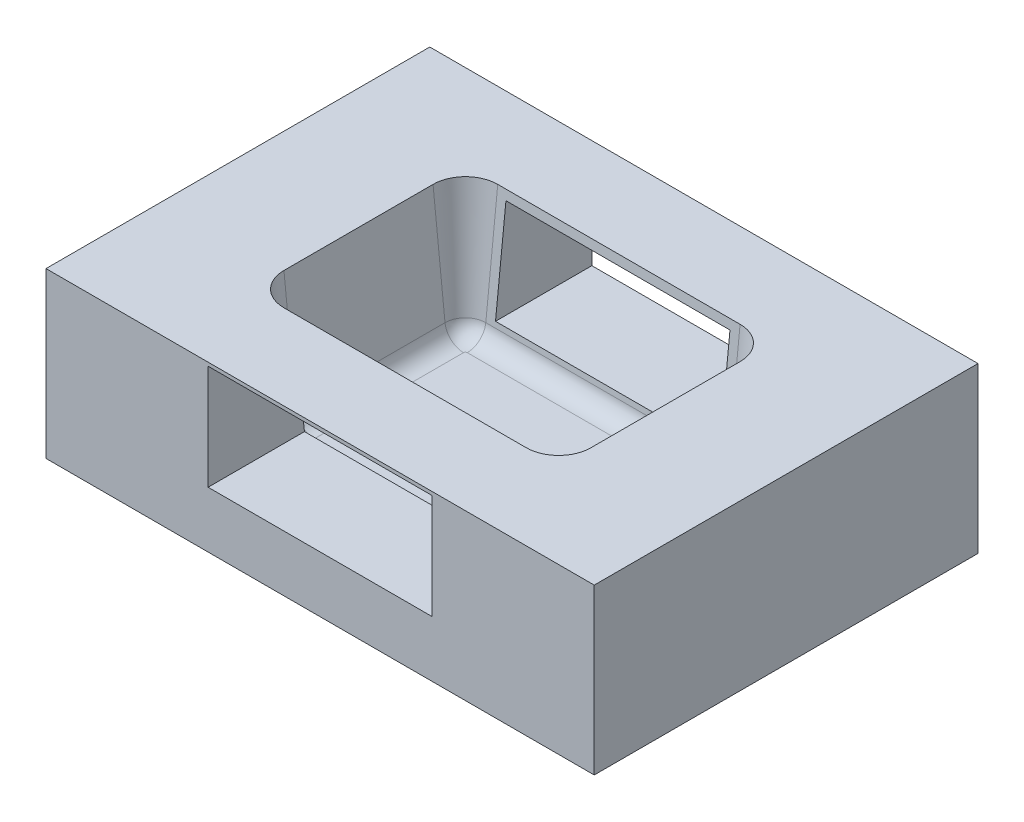
ISO-10303-21;
HEADER;
FILE_DESCRIPTION(('STEP AP214'),'2;1');
FILE_NAME('part.step','',(''),(''),'','','');
FILE_SCHEMA(('AUTOMOTIVE_DESIGN { 1 0 10303 214 1 1 1 1 }'));
ENDSEC;
DATA;
#1=APPLICATION_CONTEXT('core data for automotive mechanical design processes');
#2=APPLICATION_PROTOCOL_DEFINITION('international standard','automotive_design',2000,#1);
#3=PRODUCT_CONTEXT('',#1,'mechanical');
#4=PRODUCT('Part','Part','',(#3));
#5=PRODUCT_RELATED_PRODUCT_CATEGORY('part','',(#4));
#6=PRODUCT_DEFINITION_FORMATION('','',#4);
#7=PRODUCT_DEFINITION_CONTEXT('part definition',#1,'design');
#8=PRODUCT_DEFINITION('design','',#6,#7);
#9=PRODUCT_DEFINITION_SHAPE('','',#8);
#10=(LENGTH_UNIT() NAMED_UNIT(*) SI_UNIT(.MILLI.,.METRE.));
#11=(NAMED_UNIT(*) PLANE_ANGLE_UNIT() SI_UNIT($,.RADIAN.));
#12=(NAMED_UNIT(*) SI_UNIT($,.STERADIAN.) SOLID_ANGLE_UNIT());
#13=UNCERTAINTY_MEASURE_WITH_UNIT(LENGTH_MEASURE(1.E-05),#10,'distance_accuracy_value','');
#14=(GEOMETRIC_REPRESENTATION_CONTEXT(3) GLOBAL_UNCERTAINTY_ASSIGNED_CONTEXT((#13)) GLOBAL_UNIT_ASSIGNED_CONTEXT((#10,
#11,#12)) REPRESENTATION_CONTEXT('',''));
#15=CARTESIAN_POINT('',(0.,0.,0.));
#16=DIRECTION('',(0.,0.,1.));
#17=DIRECTION('',(1.,0.,0.));
#18=AXIS2_PLACEMENT_3D('',#15,#16,#17);
#19=CARTESIAN_POINT('',(61.3012654297794,65.8020102105601,-57.9818000816311));
#20=DIRECTION('',(0.,1.,0.));
#21=DIRECTION('',(0.,0.,1.));
#22=AXIS2_PLACEMENT_3D('',#19,#20,#21);
#23=PLANE('',#22);
#24=DIRECTION('',(1.,0.,0.));
#25=VECTOR('',#24,1.);
#26=CARTESIAN_POINT('',(-150.,65.8020102105601,-105.));
#27=LINE('',#26,#25);
#28=CARTESIAN_POINT('',(-61.2987345702204,65.8020102105601,-105.));
#29=VERTEX_POINT('',#28);
#30=CARTESIAN_POINT('',(61.3012654297794,65.8020102105601,-105.));
#31=VERTEX_POINT('',#30);
#32=EDGE_CURVE('E280',#29,#31,#27,.T.);
#33=ORIENTED_EDGE('',*,*,#32,.T.);
#34=DIRECTION('',(0.,0.,-1.));
#35=VECTOR('',#34,1.);
#36=CARTESIAN_POINT('',(61.3012654297794,65.8020102105601,-57.9818000816311));
#37=LINE('',#36,#35);
#38=CARTESIAN_POINT('',(61.3012654297794,65.8020102105601,-57.9818000816311));
#39=VERTEX_POINT('',#38);
#40=EDGE_CURVE('E50',#39,#31,#37,.T.);
#41=ORIENTED_EDGE('',*,*,#40,.F.);
#42=DIRECTION('',(1.,0.,0.));
#43=VECTOR('',#42,1.);
#44=CARTESIAN_POINT('',(-66.2987345702204,65.8020102105601,-57.9818000816311));
#45=LINE('',#44,#43);
#46=CARTESIAN_POINT('',(-61.2987345702204,65.8020102105601,-57.9818000816311));
#47=VERTEX_POINT('',#46);
#48=EDGE_CURVE('E58',#39,#47,#45,.F.);
#49=ORIENTED_EDGE('',*,*,#48,.T.);
#50=DIRECTION('',(0.,0.,-1.));
#51=VECTOR('',#50,1.);
#52=CARTESIAN_POINT('',(-61.2987345702204,65.8020102105601,-57.9818000816311));
#53=LINE('',#52,#51);
#54=EDGE_CURVE('E11',#47,#29,#53,.T.);
#55=ORIENTED_EDGE('',*,*,#54,.T.);
#56=EDGE_LOOP('',(#33,#41,#49,#55));
#57=FACE_BOUND('',#56,.T.);
#58=ADVANCED_FACE('F41',(#57),#23,.F.);
#59=CARTESIAN_POINT('',(-61.2987345702204,65.8020102105601,-57.9818000816311));
#60=DIRECTION('',(-1.,0.,0.));
#61=DIRECTION('',(0.,0.,1.));
#62=AXIS2_PLACEMENT_3D('',#59,#60,#61);
#63=PLANE('',#62);
#64=DIRECTION('',(0.,1.,0.));
#65=VECTOR('',#64,1.);
#66=CARTESIAN_POINT('',(-61.2987345702204,105.774619687402,-105.));
#67=LINE('',#66,#65);
#68=CARTESIAN_POINT('',(-61.2987345702204,11.4919950481763,-105.));
#69=VERTEX_POINT('',#68);
#70=EDGE_CURVE('E284',#69,#29,#67,.T.);
#71=ORIENTED_EDGE('',*,*,#70,.T.);
#72=ORIENTED_EDGE('',*,*,#54,.F.);
#73=DIRECTION('',(0.,0.994521895368273,-0.104528463267654));
#74=VECTOR('',#73,1.);
#75=CARTESIAN_POINT('',(-61.2987345702204,-0.625380312598491,-51.));
#76=LINE('',#75,#74);
#77=CARTESIAN_POINT('',(-61.2987345702204,11.4919950481763,-52.2735874707214));
#78=VERTEX_POINT('',#77);
#79=EDGE_CURVE('E273',#47,#78,#76,.F.);
#80=ORIENTED_EDGE('',*,*,#79,.T.);
#81=DIRECTION('',(0.,0.,-1.));
#82=VECTOR('',#81,1.);
#83=CARTESIAN_POINT('',(-61.2987345702204,11.4919950481763,-52.2735874707214));
#84=LINE('',#83,#82);
#85=EDGE_CURVE('E287',#78,#69,#84,.T.);
#86=ORIENTED_EDGE('',*,*,#85,.T.);
#87=EDGE_LOOP('',(#71,#72,#80,#86));
#88=FACE_BOUND('',#87,.T.);
#89=ADVANCED_FACE('F295',(#88),#63,.F.);
#90=CARTESIAN_POINT('',(61.3012654297794,11.4919950481763,-52.2735874707214));
#91=DIRECTION('',(0.,-1.,0.));
#92=DIRECTION('',(0.,0.,-1.));
#93=AXIS2_PLACEMENT_3D('',#90,#91,#92);
#94=PLANE('',#93);
#95=DIRECTION('',(-1.,0.,0.));
#96=VECTOR('',#95,1.);
#97=CARTESIAN_POINT('',(-150.,11.4919950481763,-105.));
#98=LINE('',#97,#96);
#99=CARTESIAN_POINT('',(61.3012654297794,11.4919950481763,-105.));
#100=VERTEX_POINT('',#99);
#101=EDGE_CURVE('E281',#100,#69,#98,.T.);
#102=ORIENTED_EDGE('',*,*,#101,.T.);
#103=ORIENTED_EDGE('',*,*,#85,.F.);
#104=DIRECTION('',(-1.,0.,0.));
#105=VECTOR('',#104,1.);
#106=CARTESIAN_POINT('',(-66.2987345702204,11.4919950481763,-52.2735874707214));
#107=LINE('',#106,#105);
#108=CARTESIAN_POINT('',(61.3012654297794,11.4919950481763,-52.2735874707214));
#109=VERTEX_POINT('',#108);
#110=EDGE_CURVE('E275',#78,#109,#107,.F.);
#111=ORIENTED_EDGE('',*,*,#110,.T.);
#112=DIRECTION('',(0.,0.,-1.));
#113=VECTOR('',#112,1.);
#114=CARTESIAN_POINT('',(61.3012654297794,11.4919950481763,-52.2735874707214));
#115=LINE('',#114,#113);
#116=EDGE_CURVE('E272',#109,#100,#115,.T.);
#117=ORIENTED_EDGE('',*,*,#116,.T.);
#118=EDGE_LOOP('',(#102,#103,#111,#117));
#119=FACE_BOUND('',#118,.T.);
#120=ADVANCED_FACE('F308',(#119),#94,.F.);
#121=CARTESIAN_POINT('',(61.3012654297794,65.8020102105601,-57.9818000816311));
#122=DIRECTION('',(1.,0.,0.));
#123=DIRECTION('',(0.,0.,-1.));
#124=AXIS2_PLACEMENT_3D('',#121,#122,#123);
#125=PLANE('',#124);
#126=DIRECTION('',(0.,-1.,0.));
#127=VECTOR('',#126,1.);
#128=CARTESIAN_POINT('',(61.3012654297794,105.774619687401,-105.));
#129=LINE('',#128,#127);
#130=EDGE_CURVE('E45',#31,#100,#129,.T.);
#131=ORIENTED_EDGE('',*,*,#130,.T.);
#132=ORIENTED_EDGE('',*,*,#116,.F.);
#133=DIRECTION('',(0.,-0.994521895368273,0.104528463267654));
#134=VECTOR('',#133,1.);
#135=CARTESIAN_POINT('',(61.3012654297794,-0.625380312598508,-51.));
#136=LINE('',#135,#134);
#137=EDGE_CURVE('E277',#109,#39,#136,.F.);
#138=ORIENTED_EDGE('',*,*,#137,.T.);
#139=ORIENTED_EDGE('',*,*,#40,.T.);
#140=EDGE_LOOP('',(#131,#132,#138,#139));
#141=FACE_BOUND('',#140,.T.);
#142=ADVANCED_FACE('F43',(#141),#125,.F.);
#143=CARTESIAN_POINT('',(-66.2987345702205,9.57461968740151,40.8));
#144=DIRECTION('',(0.,1.,0.));
#145=DIRECTION('',(0.,0.,1.));
#146=AXIS2_PLACEMENT_3D('',#143,#144,#145);
#147=DEGENERATE_TOROIDAL_SURFACE('',#146,1.01587874816203,10.2,.T.);
#148=CARTESIAN_POINT('',(-67.3146133183826,9.57461968740151,40.7999999999999));
#149=DIRECTION('',(0.,0.,1.));
#150=DIRECTION('',(0.,-1.,0.));
#151=AXIS2_PLACEMENT_3D('',#148,#149,#150);
#152=CIRCLE('',#151,10.2);
#153=CARTESIAN_POINT('',(-77.4587366511389,8.50842936207144,40.7999999999999));
#154=VERTEX_POINT('',#153);
#155=CARTESIAN_POINT('',(-67.3146133183826,-0.625380312598492,40.8));
#156=VERTEX_POINT('',#155);
#157=EDGE_CURVE('E370',#154,#156,#152,.T.);
#158=ORIENTED_EDGE('',*,*,#157,.F.);
#159=CARTESIAN_POINT('',(-66.2987345702205,8.50842936207143,40.8));
#160=DIRECTION('',(0.,-1.,0.));
#161=DIRECTION('',(0.,0.,-1.));
#162=AXIS2_PLACEMENT_3D('',#159,#160,#161);
#163=CIRCLE('',#162,11.1600020809184);
#164=CARTESIAN_POINT('',(-66.2987345702204,8.50842936207144,51.9600020809184));
#165=VERTEX_POINT('',#164);
#166=EDGE_CURVE('E366',#154,#165,#163,.F.);
#167=ORIENTED_EDGE('',*,*,#166,.T.);
#168=CARTESIAN_POINT('',(-66.2987345702205,9.57461968740151,41.815878748162));
#169=DIRECTION('',(-1.,0.,0.));
#170=DIRECTION('',(0.,0.,1.));
#171=AXIS2_PLACEMENT_3D('',#168,#169,#170);
#172=CIRCLE('',#171,10.2);
#173=CARTESIAN_POINT('',(-66.2987345702205,-0.625380312598492,41.815878748162));
#174=VERTEX_POINT('',#173);
#175=EDGE_CURVE('E407',#174,#165,#172,.T.);
#176=ORIENTED_EDGE('',*,*,#175,.F.);
#177=CARTESIAN_POINT('',(-66.2987345702205,-0.625380312598492,40.8));
#178=DIRECTION('',(0.,1.,0.));
#179=DIRECTION('',(0.,0.,1.));
#180=AXIS2_PLACEMENT_3D('',#177,#178,#179);
#181=CIRCLE('',#180,1.01587874816203);
#182=EDGE_CURVE('E362',#174,#156,#181,.F.);
#183=ORIENTED_EDGE('',*,*,#182,.T.);
#184=EDGE_LOOP('',(#158,#167,#176,#183));
#185=FACE_BOUND('',#184,.T.);
#186=ADVANCED_FACE('F319',(#185),#147,.F.);
#187=CARTESIAN_POINT('',(-66.2987345702204,9.57461968740151,41.815878748162));
#188=DIRECTION('',(-1.,0.,0.));
#189=DIRECTION('',(0.,0.,1.));
#190=AXIS2_PLACEMENT_3D('',#187,#188,#189);
#191=CYLINDRICAL_SURFACE('',#190,10.2);
#192=CARTESIAN_POINT('',(66.3012654297795,9.57461968740151,41.815878748162));
#193=DIRECTION('',(-1.,0.,0.));
#194=DIRECTION('',(0.,0.,1.));
#195=AXIS2_PLACEMENT_3D('',#192,#193,#194);
#196=CIRCLE('',#195,10.2);
#197=CARTESIAN_POINT('',(66.3012654297795,-0.625380312598492,41.815878748162));
#198=VERTEX_POINT('',#197);
#199=CARTESIAN_POINT('',(66.3012654297794,8.50842936207144,51.9600020809184));
#200=VERTEX_POINT('',#199);
#201=EDGE_CURVE('E400',#198,#200,#196,.T.);
#202=ORIENTED_EDGE('',*,*,#201,.F.);
#203=DIRECTION('',(-1.,0.,0.));
#204=VECTOR('',#203,1.);
#205=CARTESIAN_POINT('',(-66.2987345702205,-0.625380312598492,41.815878748162));
#206=LINE('',#205,#204);
#207=EDGE_CURVE('E235',#198,#174,#206,.T.);
#208=ORIENTED_EDGE('',*,*,#207,.T.);
#209=ORIENTED_EDGE('',*,*,#175,.T.);
#210=DIRECTION('',(1.,0.,0.));
#211=VECTOR('',#210,1.);
#212=CARTESIAN_POINT('',(-66.2987345702204,8.50842936207144,51.9600020809184));
#213=LINE('',#212,#211);
#214=EDGE_CURVE('E403',#165,#200,#213,.T.);
#215=ORIENTED_EDGE('',*,*,#214,.T.);
#216=EDGE_LOOP('',(#202,#208,#209,#215));
#217=FACE_BOUND('',#216,.T.);
#218=ADVANCED_FACE('F481',(#217),#191,.F.);
#219=CARTESIAN_POINT('',(-61.2987345702205,68.8502354840354,58.3021814679172));
#220=DIRECTION('',(0.,1.,0.));
#221=DIRECTION('',(0.,0.,1.));
#222=AXIS2_PLACEMENT_3D('',#219,#220,#221);
#223=PLANE('',#222);
#224=DIRECTION('',(-1.,0.,0.));
#225=VECTOR('',#224,1.);
#226=CARTESIAN_POINT('',(-150.,68.8502354840354,105.));
#227=LINE('',#226,#225);
#228=CARTESIAN_POINT('',(61.3012654297794,68.8502354840354,105.));
#229=VERTEX_POINT('',#228);
#230=CARTESIAN_POINT('',(-61.2987345702205,68.8502354840354,105.));
#231=VERTEX_POINT('',#230);
#232=EDGE_CURVE('E253',#229,#231,#227,.T.);
#233=ORIENTED_EDGE('',*,*,#232,.T.);
#234=DIRECTION('',(0.,0.,1.));
#235=VECTOR('',#234,1.);
#236=CARTESIAN_POINT('',(-61.2987345702205,68.8502354840354,58.3021814679172));
#237=LINE('',#236,#235);
#238=CARTESIAN_POINT('',(-61.2987345702205,68.8502354840354,58.3021814679172));
#239=VERTEX_POINT('',#238);
#240=EDGE_CURVE('E262',#239,#231,#237,.T.);
#241=ORIENTED_EDGE('',*,*,#240,.F.);
#242=DIRECTION('',(-1.,0.,0.));
#243=VECTOR('',#242,1.);
#244=CARTESIAN_POINT('',(-66.2987345702204,68.8502354840354,58.3021814679172));
#245=LINE('',#244,#243);
#246=CARTESIAN_POINT('',(61.3012654297794,68.8502354840354,58.3021814679172));
#247=VERTEX_POINT('',#246);
#248=EDGE_CURVE('E243',#239,#247,#245,.F.);
#249=ORIENTED_EDGE('',*,*,#248,.T.);
#250=DIRECTION('',(0.,0.,1.));
#251=VECTOR('',#250,1.);
#252=CARTESIAN_POINT('',(61.3012654297794,68.8502354840354,58.3021814679172));
#253=LINE('',#252,#251);
#254=EDGE_CURVE('E263',#247,#229,#253,.T.);
#255=ORIENTED_EDGE('',*,*,#254,.T.);
#256=EDGE_LOOP('',(#233,#241,#249,#255));
#257=FACE_BOUND('',#256,.T.);
#258=ADVANCED_FACE('F532',(#257),#223,.F.);
#259=CARTESIAN_POINT('',(61.3012654297794,68.8502354840354,58.3021814679172));
#260=DIRECTION('',(1.,0.,0.));
#261=DIRECTION('',(0.,1.,0.));
#262=AXIS2_PLACEMENT_3D('',#259,#260,#261);
#263=PLANE('',#262);
#264=DIRECTION('',(0.,1.,0.));
#265=VECTOR('',#264,1.);
#266=CARTESIAN_POINT('',(61.3012654297794,105.774619687402,105.));
#267=LINE('',#266,#265);
#268=CARTESIAN_POINT('',(61.3012654297794,11.4919950481763,105.));
#269=VERTEX_POINT('',#268);
#270=EDGE_CURVE('E256',#269,#229,#267,.T.);
#271=ORIENTED_EDGE('',*,*,#270,.T.);
#272=ORIENTED_EDGE('',*,*,#254,.F.);
#273=DIRECTION('',(0.,0.994521895368273,0.104528463267654));
#274=VECTOR('',#273,1.);
#275=CARTESIAN_POINT('',(61.3012654297794,-0.625380312598446,51.));
#276=LINE('',#275,#274);
#277=CARTESIAN_POINT('',(61.3012654297794,11.4919950481763,52.2735874707214));
#278=VERTEX_POINT('',#277);
#279=EDGE_CURVE('E246',#247,#278,#276,.F.);
#280=ORIENTED_EDGE('',*,*,#279,.T.);
#281=DIRECTION('',(0.,0.,1.));
#282=VECTOR('',#281,1.);
#283=CARTESIAN_POINT('',(61.3012654297794,11.4919950481763,52.2735874707214));
#284=LINE('',#283,#282);
#285=EDGE_CURVE('E259',#278,#269,#284,.T.);
#286=ORIENTED_EDGE('',*,*,#285,.T.);
#287=EDGE_LOOP('',(#271,#272,#280,#286));
#288=FACE_BOUND('',#287,.T.);
#289=ADVANCED_FACE('F535',(#288),#263,.F.);
#290=CARTESIAN_POINT('',(-61.2987345702204,11.4919950481763,52.2735874707214));
#291=DIRECTION('',(0.,-1.,0.));
#292=DIRECTION('',(0.,0.,-1.));
#293=AXIS2_PLACEMENT_3D('',#290,#291,#292);
#294=PLANE('',#293);
#295=DIRECTION('',(1.,0.,0.));
#296=VECTOR('',#295,1.);
#297=CARTESIAN_POINT('',(-150.,11.4919950481763,105.));
#298=LINE('',#297,#296);
#299=CARTESIAN_POINT('',(-61.2987345702204,11.4919950481763,105.));
#300=VERTEX_POINT('',#299);
#301=EDGE_CURVE('E231',#300,#269,#298,.T.);
#302=ORIENTED_EDGE('',*,*,#301,.T.);
#303=ORIENTED_EDGE('',*,*,#285,.F.);
#304=DIRECTION('',(1.,0.,0.));
#305=VECTOR('',#304,1.);
#306=CARTESIAN_POINT('',(-66.2987345702204,11.4919950481763,52.2735874707214));
#307=LINE('',#306,#305);
#308=CARTESIAN_POINT('',(-61.2987345702205,11.4919950481763,52.2735874707214));
#309=VERTEX_POINT('',#308);
#310=EDGE_CURVE('E248',#278,#309,#307,.F.);
#311=ORIENTED_EDGE('',*,*,#310,.T.);
#312=DIRECTION('',(0.,0.,1.));
#313=VECTOR('',#312,1.);
#314=CARTESIAN_POINT('',(-61.2987345702204,11.4919950481763,52.2735874707214));
#315=LINE('',#314,#313);
#316=EDGE_CURVE('E245',#309,#300,#315,.T.);
#317=ORIENTED_EDGE('',*,*,#316,.T.);
#318=EDGE_LOOP('',(#302,#303,#311,#317));
#319=FACE_BOUND('',#318,.T.);
#320=ADVANCED_FACE('F538',(#319),#294,.F.);
#321=CARTESIAN_POINT('',(-61.2987345702205,68.8502354840354,58.3021814679172));
#322=DIRECTION('',(-1.,0.,0.));
#323=DIRECTION('',(0.,0.,1.));
#324=AXIS2_PLACEMENT_3D('',#321,#322,#323);
#325=PLANE('',#324);
#326=DIRECTION('',(0.,-1.,0.));
#327=VECTOR('',#326,1.);
#328=CARTESIAN_POINT('',(-61.2987345702205,105.774619687402,105.));
#329=LINE('',#328,#327);
#330=EDGE_CURVE('E228',#231,#300,#329,.T.);
#331=ORIENTED_EDGE('',*,*,#330,.T.);
#332=ORIENTED_EDGE('',*,*,#316,.F.);
#333=DIRECTION('',(0.,-0.994521895368273,-0.104528463267654));
#334=VECTOR('',#333,1.);
#335=CARTESIAN_POINT('',(-61.2987345702204,-0.625380312598491,51.));
#336=LINE('',#335,#334);
#337=EDGE_CURVE('E250',#309,#239,#336,.F.);
#338=ORIENTED_EDGE('',*,*,#337,.T.);
#339=ORIENTED_EDGE('',*,*,#240,.T.);
#340=EDGE_LOOP('',(#331,#332,#338,#339));
#341=FACE_BOUND('',#340,.T.);
#342=ADVANCED_FACE('F311',(#341),#325,.F.);
#343=CARTESIAN_POINT('',(66.3012654297795,9.57461968740151,40.8));
#344=DIRECTION('',(0.,1.,0.));
#345=DIRECTION('',(0.,0.,1.));
#346=AXIS2_PLACEMENT_3D('',#343,#344,#345);
#347=DEGENERATE_TOROIDAL_SURFACE('',#346,1.01587874816203,10.2,.T.);
#348=CARTESIAN_POINT('',(67.3171441779415,9.57461968740151,40.7999999999999));
#349=DIRECTION('',(0.,0.,1.));
#350=DIRECTION('',(1.,0.,0.));
#351=AXIS2_PLACEMENT_3D('',#348,#349,#350);
#352=CIRCLE('',#351,10.2);
#353=CARTESIAN_POINT('',(67.3171441779415,-0.625380312598492,40.7999999999999));
#354=VERTEX_POINT('',#353);
#355=CARTESIAN_POINT('',(77.4612675106979,8.50842936207144,40.7999999999999));
#356=VERTEX_POINT('',#355);
#357=EDGE_CURVE('E393',#354,#356,#352,.T.);
#358=ORIENTED_EDGE('',*,*,#357,.F.);
#359=CARTESIAN_POINT('',(66.3012654297795,-0.625380312598492,40.8));
#360=DIRECTION('',(0.,1.,0.));
#361=DIRECTION('',(0.,0.,1.));
#362=AXIS2_PLACEMENT_3D('',#359,#360,#361);
#363=CIRCLE('',#362,1.01587874816203);
#364=EDGE_CURVE('E406',#354,#198,#363,.F.);
#365=ORIENTED_EDGE('',*,*,#364,.T.);
#366=ORIENTED_EDGE('',*,*,#201,.T.);
#367=CARTESIAN_POINT('',(66.3012654297795,8.50842936207143,40.8));
#368=DIRECTION('',(0.,-1.,0.));
#369=DIRECTION('',(0.,0.,-1.));
#370=AXIS2_PLACEMENT_3D('',#367,#368,#369);
#371=CIRCLE('',#370,11.1600020809184);
#372=EDGE_CURVE('E396',#200,#356,#371,.F.);
#373=ORIENTED_EDGE('',*,*,#372,.T.);
#374=EDGE_LOOP('',(#358,#365,#366,#373));
#375=FACE_BOUND('',#374,.T.);
#376=ADVANCED_FACE('F427',(#375),#347,.F.);
#377=CARTESIAN_POINT('',(-67.3146133183826,9.57461968740151,-40.7999999999999));
#378=DIRECTION('',(0.,0.,-1.));
#379=DIRECTION('',(-1.,0.,0.));
#380=AXIS2_PLACEMENT_3D('',#377,#378,#379);
#381=CYLINDRICAL_SURFACE('',#380,10.2);
#382=CARTESIAN_POINT('',(-67.3146133183826,9.57461968740151,-40.8));
#383=DIRECTION('',(0.,0.,1.));
#384=DIRECTION('',(0.,-1.,0.));
#385=AXIS2_PLACEMENT_3D('',#382,#383,#384);
#386=CIRCLE('',#385,10.2);
#387=CARTESIAN_POINT('',(-77.4587366511389,8.50842936207144,-40.7999999999999));
#388=VERTEX_POINT('',#387);
#389=CARTESIAN_POINT('',(-67.3146133183826,-0.625380312598492,-40.7999999999999));
#390=VERTEX_POINT('',#389);
#391=EDGE_CURVE('E375',#388,#390,#386,.T.);
#392=ORIENTED_EDGE('',*,*,#391,.F.);
#393=DIRECTION('',(0.,0.,1.));
#394=VECTOR('',#393,1.);
#395=CARTESIAN_POINT('',(-77.4587366511389,8.50842936207144,-40.7999999999999));
#396=LINE('',#395,#394);
#397=EDGE_CURVE('E372',#388,#154,#396,.T.);
#398=ORIENTED_EDGE('',*,*,#397,.T.);
#399=ORIENTED_EDGE('',*,*,#157,.T.);
#400=DIRECTION('',(0.,0.,-1.));
#401=VECTOR('',#400,1.);
#402=CARTESIAN_POINT('',(-67.3146133183826,-0.625380312598492,40.8));
#403=LINE('',#402,#401);
#404=EDGE_CURVE('E369',#156,#390,#403,.T.);
#405=ORIENTED_EDGE('',*,*,#404,.T.);
#406=EDGE_LOOP('',(#392,#398,#399,#405));
#407=FACE_BOUND('',#406,.T.);
#408=ADVANCED_FACE('F500',(#407),#381,.F.);
#409=CARTESIAN_POINT('',(67.3171441779415,9.57461968740151,-40.7999999999999));
#410=DIRECTION('',(0.,0.,1.));
#411=DIRECTION('',(1.,0.,0.));
#412=AXIS2_PLACEMENT_3D('',#409,#410,#411);
#413=CYLINDRICAL_SURFACE('',#412,10.2);
#414=CARTESIAN_POINT('',(67.3171441779415,9.57461968740151,-40.8));
#415=DIRECTION('',(0.,0.,1.));
#416=DIRECTION('',(1.,0.,0.));
#417=AXIS2_PLACEMENT_3D('',#414,#415,#416);
#418=CIRCLE('',#417,10.2);
#419=CARTESIAN_POINT('',(67.3171441779415,-0.625380312598492,-40.8));
#420=VERTEX_POINT('',#419);
#421=CARTESIAN_POINT('',(77.4612675106979,8.50842936207144,-40.7999999999999));
#422=VERTEX_POINT('',#421);
#423=EDGE_CURVE('E389',#420,#422,#418,.T.);
#424=ORIENTED_EDGE('',*,*,#423,.F.);
#425=DIRECTION('',(0.,0.,1.));
#426=VECTOR('',#425,1.);
#427=CARTESIAN_POINT('',(67.3171441779415,-0.625380312598492,40.8));
#428=LINE('',#427,#426);
#429=EDGE_CURVE('E399',#420,#354,#428,.T.);
#430=ORIENTED_EDGE('',*,*,#429,.T.);
#431=ORIENTED_EDGE('',*,*,#357,.T.);
#432=DIRECTION('',(0.,0.,-1.));
#433=VECTOR('',#432,1.);
#434=CARTESIAN_POINT('',(77.4612675106979,8.50842936207144,-40.7999999999999));
#435=LINE('',#434,#433);
#436=EDGE_CURVE('E390',#356,#422,#435,.T.);
#437=ORIENTED_EDGE('',*,*,#436,.T.);
#438=EDGE_LOOP('',(#424,#430,#431,#437));
#439=FACE_BOUND('',#438,.T.);
#440=ADVANCED_FACE('F472',(#439),#413,.F.);
#441=CARTESIAN_POINT('',(-150.,105.774619687402,105.));
#442=DIRECTION('',(0.,0.,1.));
#443=DIRECTION('',(1.,0.,0.));
#444=AXIS2_PLACEMENT_3D('',#441,#442,#443);
#445=PLANE('',#444);
#446=ORIENTED_EDGE('',*,*,#330,.F.);
#447=ORIENTED_EDGE('',*,*,#232,.F.);
#448=ORIENTED_EDGE('',*,*,#270,.F.);
#449=ORIENTED_EDGE('',*,*,#301,.F.);
#450=EDGE_LOOP('',(#446,#447,#448,#449));
#451=FACE_BOUND('',#450,.T.);
#452=DIRECTION('',(1.,0.,0.));
#453=VECTOR('',#452,1.);
#454=CARTESIAN_POINT('',(-150.,70.7746196874015,105.));
#455=LINE('',#454,#453);
#456=CARTESIAN_POINT('',(-150.,70.7746196874015,105.));
#457=VERTEX_POINT('',#456);
#458=CARTESIAN_POINT('',(150.,70.7746196874015,105.));
#459=VERTEX_POINT('',#458);
#460=EDGE_CURVE('E216',#457,#459,#455,.T.);
#461=ORIENTED_EDGE('',*,*,#460,.F.);
#462=DIRECTION('',(0.,-1.,0.));
#463=VECTOR('',#462,1.);
#464=CARTESIAN_POINT('',(-150.,105.774619687402,105.));
#465=LINE('',#464,#463);
#466=CARTESIAN_POINT('',(-150.,-19.2253803125985,105.));
#467=VERTEX_POINT('',#466);
#468=EDGE_CURVE('E201',#457,#467,#465,.T.);
#469=ORIENTED_EDGE('',*,*,#468,.T.);
#470=DIRECTION('',(-1.,0.,0.));
#471=VECTOR('',#470,1.);
#472=CARTESIAN_POINT('',(-150.,-19.2253803125985,105.));
#473=LINE('',#472,#471);
#474=CARTESIAN_POINT('',(150.,-19.2253803125985,105.));
#475=VERTEX_POINT('',#474);
#476=EDGE_CURVE('E441',#475,#467,#473,.T.);
#477=ORIENTED_EDGE('',*,*,#476,.F.);
#478=DIRECTION('',(0.,-1.,0.));
#479=VECTOR('',#478,1.);
#480=CARTESIAN_POINT('',(150.,105.774619687402,105.));
#481=LINE('',#480,#479);
#482=EDGE_CURVE('E218',#459,#475,#481,.T.);
#483=ORIENTED_EDGE('',*,*,#482,.F.);
#484=EDGE_LOOP('',(#461,#469,#477,#483));
#485=FACE_BOUND('',#484,.T.);
#486=ADVANCED_FACE('F217',(#451,#485),#445,.T.);
#487=CARTESIAN_POINT('',(-66.2987345702205,-0.625380312598492,40.8));
#488=DIRECTION('',(0.,1.,0.));
#489=DIRECTION('',(0.,0.,1.));
#490=AXIS2_PLACEMENT_3D('',#487,#488,#489);
#491=PLANE('',#490);
#492=ORIENTED_EDGE('',*,*,#207,.F.);
#493=ORIENTED_EDGE('',*,*,#364,.F.);
#494=ORIENTED_EDGE('',*,*,#429,.F.);
#495=CARTESIAN_POINT('',(66.3012654297795,-0.625380312598492,-40.8));
#496=DIRECTION('',(0.,1.,0.));
#497=DIRECTION('',(0.,0.,1.));
#498=AXIS2_PLACEMENT_3D('',#495,#496,#497);
#499=CIRCLE('',#498,1.01587874816203);
#500=CARTESIAN_POINT('',(66.3012654297794,-0.625380312598492,-41.815878748162));
#501=VERTEX_POINT('',#500);
#502=EDGE_CURVE('E384',#501,#420,#499,.F.);
#503=ORIENTED_EDGE('',*,*,#502,.F.);
#504=DIRECTION('',(1.,0.,0.));
#505=VECTOR('',#504,1.);
#506=CARTESIAN_POINT('',(-66.2987345702205,-0.625380312598492,-41.815878748162));
#507=LINE('',#506,#505);
#508=CARTESIAN_POINT('',(-66.2987345702205,-0.625380312598492,-41.815878748162));
#509=VERTEX_POINT('',#508);
#510=EDGE_CURVE('E380',#509,#501,#507,.T.);
#511=ORIENTED_EDGE('',*,*,#510,.F.);
#512=CARTESIAN_POINT('',(-66.2987345702205,-0.625380312598492,-40.8));
#513=DIRECTION('',(0.,1.,0.));
#514=DIRECTION('',(0.,0.,1.));
#515=AXIS2_PLACEMENT_3D('',#512,#513,#514);
#516=CIRCLE('',#515,1.01587874816203);
#517=EDGE_CURVE('E374',#390,#509,#516,.F.);
#518=ORIENTED_EDGE('',*,*,#517,.F.);
#519=ORIENTED_EDGE('',*,*,#404,.F.);
#520=ORIENTED_EDGE('',*,*,#182,.F.);
#521=EDGE_LOOP('',(#492,#493,#494,#503,#511,#518,#519,#520));
#522=FACE_BOUND('',#521,.T.);
#523=ADVANCED_FACE('F431',(#522),#491,.T.);
#524=CARTESIAN_POINT('',(-66.2987345702205,9.57461968740151,-40.8));
#525=DIRECTION('',(0.,1.,0.));
#526=DIRECTION('',(0.,0.,1.));
#527=AXIS2_PLACEMENT_3D('',#524,#525,#526);
#528=DEGENERATE_TOROIDAL_SURFACE('',#527,1.01587874816203,10.2,.T.);
#529=CARTESIAN_POINT('',(-66.2987345702204,9.57461968740151,-41.815878748162));
#530=DIRECTION('',(-1.,0.,0.));
#531=DIRECTION('',(0.,-1.,0.));
#532=AXIS2_PLACEMENT_3D('',#529,#530,#531);
#533=CIRCLE('',#532,10.2);
#534=CARTESIAN_POINT('',(-66.2987345702204,8.50842936207144,-51.9600020809184));
#535=VERTEX_POINT('',#534);
#536=EDGE_CURVE('E381',#535,#509,#533,.T.);
#537=ORIENTED_EDGE('',*,*,#536,.F.);
#538=CARTESIAN_POINT('',(-66.2987345702205,8.50842936207143,-40.8));
#539=DIRECTION('',(0.,-1.,0.));
#540=DIRECTION('',(0.,0.,-1.));
#541=AXIS2_PLACEMENT_3D('',#538,#539,#540);
#542=CIRCLE('',#541,11.1600020809184);
#543=EDGE_CURVE('E377',#535,#388,#542,.F.);
#544=ORIENTED_EDGE('',*,*,#543,.T.);
#545=ORIENTED_EDGE('',*,*,#391,.T.);
#546=ORIENTED_EDGE('',*,*,#517,.T.);
#547=EDGE_LOOP('',(#537,#544,#545,#546));
#548=FACE_BOUND('',#547,.T.);
#549=ADVANCED_FACE('F463',(#548),#528,.F.);
#550=CARTESIAN_POINT('',(-66.2987345702205,-0.625380312598492,40.8));
#551=DIRECTION('',(0.,1.,0.));
#552=DIRECTION('',(0.,0.,1.));
#553=AXIS2_PLACEMENT_3D('',#550,#551,#552);
#554=CONICAL_SURFACE('',#553,10.2,0.10471975511966);
#555=DIRECTION('',(-0.104528463267654,0.994521895368273,0.));
#556=VECTOR('',#555,1.);
#557=CARTESIAN_POINT('',(-76.4987345702205,-0.625380312598493,40.7999999999999));
#558=LINE('',#557,#556);
#559=CARTESIAN_POINT('',(-84.0031769681898,70.7746196874015,40.7999999999999));
#560=VERTEX_POINT('',#559);
#561=EDGE_CURVE('E223',#560,#154,#558,.F.);
#562=ORIENTED_EDGE('',*,*,#561,.F.);
#563=CARTESIAN_POINT('',(-66.2987345702205,70.7746196874015,40.8));
#564=DIRECTION('',(0.,1.,0.));
#565=DIRECTION('',(0.,0.,1.));
#566=AXIS2_PLACEMENT_3D('',#563,#564,#565);
#567=CIRCLE('',#566,17.7044423979693);
#568=CARTESIAN_POINT('',(-66.2987345702204,70.7746196874015,58.5044423979693));
#569=VERTEX_POINT('',#568);
#570=EDGE_CURVE('E360',#560,#569,#567,.T.);
#571=ORIENTED_EDGE('',*,*,#570,.T.);
#572=DIRECTION('',(0.,0.994521895368273,0.104528463267654));
#573=VECTOR('',#572,1.);
#574=CARTESIAN_POINT('',(-66.2987345702204,-0.625380312598492,51.));
#575=LINE('',#574,#573);
#576=EDGE_CURVE('E358',#569,#165,#575,.F.);
#577=ORIENTED_EDGE('',*,*,#576,.T.);
#578=ORIENTED_EDGE('',*,*,#166,.F.);
#579=EDGE_LOOP('',(#562,#571,#577,#578));
#580=FACE_BOUND('',#579,.T.);
#581=ADVANCED_FACE('F490',(#580),#554,.F.);
#582=CARTESIAN_POINT('',(-66.2987345702204,-0.625380312598492,51.));
#583=DIRECTION('',(0.,-0.104528463267654,0.994521895368273));
#584=DIRECTION('',(0.,-0.994521895368273,-0.104528463267654));
#585=AXIS2_PLACEMENT_3D('',#582,#583,#584);
#586=PLANE('',#585);
#587=ORIENTED_EDGE('',*,*,#337,.F.);
#588=ORIENTED_EDGE('',*,*,#310,.F.);
#589=ORIENTED_EDGE('',*,*,#279,.F.);
#590=ORIENTED_EDGE('',*,*,#248,.F.);
#591=EDGE_LOOP('',(#587,#588,#589,#590));
#592=FACE_BOUND('',#591,.T.);
#593=ORIENTED_EDGE('',*,*,#576,.F.);
#594=DIRECTION('',(-1.,0.,0.));
#595=VECTOR('',#594,1.);
#596=CARTESIAN_POINT('',(-66.2987345702204,70.7746196874015,58.5044423979693));
#597=LINE('',#596,#595);
#598=CARTESIAN_POINT('',(66.3012654297794,70.7746196874015,58.5044423979693));
#599=VERTEX_POINT('',#598);
#600=EDGE_CURVE('E356',#569,#599,#597,.F.);
#601=ORIENTED_EDGE('',*,*,#600,.T.);
#602=DIRECTION('',(0.,0.994521895368273,0.104528463267654));
#603=VECTOR('',#602,1.);
#604=CARTESIAN_POINT('',(66.3012654297794,-0.625380312598493,51.));
#605=LINE('',#604,#603);
#606=EDGE_CURVE('E354',#599,#200,#605,.F.);
#607=ORIENTED_EDGE('',*,*,#606,.T.);
#608=ORIENTED_EDGE('',*,*,#214,.F.);
#609=EDGE_LOOP('',(#593,#601,#607,#608));
#610=FACE_BOUND('',#609,.T.);
#611=ADVANCED_FACE('F484',(#592,#610),#586,.F.);
#612=CARTESIAN_POINT('',(66.3012654297795,-0.625380312598492,40.8));
#613=DIRECTION('',(0.,1.,0.));
#614=DIRECTION('',(0.,0.,1.));
#615=AXIS2_PLACEMENT_3D('',#612,#613,#614);
#616=CONICAL_SURFACE('',#615,10.2,0.10471975511966);
#617=ORIENTED_EDGE('',*,*,#606,.F.);
#618=CARTESIAN_POINT('',(66.3012654297795,70.7746196874015,40.8));
#619=DIRECTION('',(0.,1.,0.));
#620=DIRECTION('',(0.,0.,1.));
#621=AXIS2_PLACEMENT_3D('',#618,#619,#620);
#622=CIRCLE('',#621,17.7044423979693);
#623=CARTESIAN_POINT('',(84.0057078277488,70.7746196874015,40.7999999999999));
#624=VERTEX_POINT('',#623);
#625=EDGE_CURVE('E352',#599,#624,#622,.T.);
#626=ORIENTED_EDGE('',*,*,#625,.T.);
#627=DIRECTION('',(0.104528463267654,0.994521895368273,0.));
#628=VECTOR('',#627,1.);
#629=CARTESIAN_POINT('',(76.5012654297795,-0.625380312598492,40.7999999999999));
#630=LINE('',#629,#628);
#631=EDGE_CURVE('E350',#624,#356,#630,.F.);
#632=ORIENTED_EDGE('',*,*,#631,.T.);
#633=ORIENTED_EDGE('',*,*,#372,.F.);
#634=EDGE_LOOP('',(#617,#626,#632,#633));
#635=FACE_BOUND('',#634,.T.);
#636=ADVANCED_FACE('F479',(#635),#616,.F.);
#637=CARTESIAN_POINT('',(-76.4987345702205,-0.625380312598492,-40.7999999999999));
#638=DIRECTION('',(-0.994521895368273,-0.104528463267654,0.));
#639=DIRECTION('',(0.104528463267654,-0.994521895368273,0.));
#640=AXIS2_PLACEMENT_3D('',#637,#638,#639);
#641=PLANE('',#640);
#642=DIRECTION('',(-0.104528463267654,0.994521895368273,0.));
#643=VECTOR('',#642,1.);
#644=CARTESIAN_POINT('',(-76.4987345702205,-0.625380312598492,-40.7999999999999));
#645=LINE('',#644,#643);
#646=CARTESIAN_POINT('',(-84.0031769681898,70.7746196874015,-40.7999999999999));
#647=VERTEX_POINT('',#646);
#648=EDGE_CURVE('E447',#647,#388,#645,.F.);
#649=ORIENTED_EDGE('',*,*,#648,.F.);
#650=DIRECTION('',(0.,0.,-1.));
#651=VECTOR('',#650,1.);
#652=CARTESIAN_POINT('',(-84.0031769681898,70.7746196874015,-40.7999999999999));
#653=LINE('',#652,#651);
#654=EDGE_CURVE('E365',#647,#560,#653,.F.);
#655=ORIENTED_EDGE('',*,*,#654,.T.);
#656=ORIENTED_EDGE('',*,*,#561,.T.);
#657=ORIENTED_EDGE('',*,*,#397,.F.);
#658=EDGE_LOOP('',(#649,#655,#656,#657));
#659=FACE_BOUND('',#658,.T.);
#660=ADVANCED_FACE('F498',(#659),#641,.F.);
#661=CARTESIAN_POINT('',(-150.,105.774619687402,-105.));
#662=DIRECTION('',(-1.,0.,0.));
#663=DIRECTION('',(0.,0.,1.));
#664=AXIS2_PLACEMENT_3D('',#661,#662,#663);
#665=PLANE('',#664);
#666=DIRECTION('',(0.,0.,1.));
#667=VECTOR('',#666,1.);
#668=CARTESIAN_POINT('',(-150.,70.7746196874015,-105.));
#669=LINE('',#668,#667);
#670=CARTESIAN_POINT('',(-150.,70.7746196874015,-105.));
#671=VERTEX_POINT('',#670);
#672=EDGE_CURVE('E205',#671,#457,#669,.T.);
#673=ORIENTED_EDGE('',*,*,#672,.F.);
#674=DIRECTION('',(0.,-1.,0.));
#675=VECTOR('',#674,1.);
#676=CARTESIAN_POINT('',(-150.,105.774619687402,-105.));
#677=LINE('',#676,#675);
#678=CARTESIAN_POINT('',(-150.,-19.2253803125985,-105.));
#679=VERTEX_POINT('',#678);
#680=EDGE_CURVE('E213',#671,#679,#677,.T.);
#681=ORIENTED_EDGE('',*,*,#680,.T.);
#682=DIRECTION('',(0.,0.,-1.));
#683=VECTOR('',#682,1.);
#684=CARTESIAN_POINT('',(-150.,-19.2253803125985,-105.));
#685=LINE('',#684,#683);
#686=EDGE_CURVE('E208',#467,#679,#685,.T.);
#687=ORIENTED_EDGE('',*,*,#686,.F.);
#688=ORIENTED_EDGE('',*,*,#468,.F.);
#689=EDGE_LOOP('',(#673,#681,#687,#688));
#690=FACE_BOUND('',#689,.T.);
#691=ADVANCED_FACE('F203',(#690),#665,.T.);
#692=CARTESIAN_POINT('',(0.,-19.2253803125985,0.));
#693=DIRECTION('',(0.,1.,0.));
#694=DIRECTION('',(0.,0.,1.));
#695=AXIS2_PLACEMENT_3D('',#692,#693,#694);
#696=PLANE('',#695);
#697=DIRECTION('',(0.,0.,1.));
#698=VECTOR('',#697,1.);
#699=CARTESIAN_POINT('',(150.,-19.2253803125985,-105.));
#700=LINE('',#699,#698);
#701=CARTESIAN_POINT('',(150.,-19.2253803125985,-105.));
#702=VERTEX_POINT('',#701);
#703=EDGE_CURVE('E212',#702,#475,#700,.T.);
#704=ORIENTED_EDGE('',*,*,#703,.T.);
#705=ORIENTED_EDGE('',*,*,#476,.T.);
#706=ORIENTED_EDGE('',*,*,#686,.T.);
#707=DIRECTION('',(1.,0.,0.));
#708=VECTOR('',#707,1.);
#709=CARTESIAN_POINT('',(-150.,-19.2253803125985,-105.));
#710=LINE('',#709,#708);
#711=EDGE_CURVE('E435',#679,#702,#710,.T.);
#712=ORIENTED_EDGE('',*,*,#711,.T.);
#713=EDGE_LOOP('',(#704,#705,#706,#712));
#714=FACE_BOUND('',#713,.T.);
#715=ADVANCED_FACE('F565',(#714),#696,.F.);
#716=CARTESIAN_POINT('',(150.,105.774619687402,-105.));
#717=DIRECTION('',(1.,0.,0.));
#718=DIRECTION('',(0.,0.,-1.));
#719=AXIS2_PLACEMENT_3D('',#716,#717,#718);
#720=PLANE('',#719);
#721=DIRECTION('',(0.,0.,-1.));
#722=VECTOR('',#721,1.);
#723=CARTESIAN_POINT('',(150.,70.7746196874015,-105.));
#724=LINE('',#723,#722);
#725=CARTESIAN_POINT('',(150.,70.7746196874015,-105.));
#726=VERTEX_POINT('',#725);
#727=EDGE_CURVE('E222',#459,#726,#724,.T.);
#728=ORIENTED_EDGE('',*,*,#727,.F.);
#729=ORIENTED_EDGE('',*,*,#482,.T.);
#730=ORIENTED_EDGE('',*,*,#703,.F.);
#731=DIRECTION('',(0.,-1.,0.));
#732=VECTOR('',#731,1.);
#733=CARTESIAN_POINT('',(150.,105.774619687402,-105.));
#734=LINE('',#733,#732);
#735=EDGE_CURVE('E239',#726,#702,#734,.T.);
#736=ORIENTED_EDGE('',*,*,#735,.F.);
#737=EDGE_LOOP('',(#728,#729,#730,#736));
#738=FACE_BOUND('',#737,.T.);
#739=ADVANCED_FACE('F570',(#738),#720,.T.);
#740=CARTESIAN_POINT('',(-150.,105.774619687402,-105.));
#741=DIRECTION('',(0.,0.,-1.));
#742=DIRECTION('',(-1.,0.,0.));
#743=AXIS2_PLACEMENT_3D('',#740,#741,#742);
#744=PLANE('',#743);
#745=ORIENTED_EDGE('',*,*,#130,.F.);
#746=ORIENTED_EDGE('',*,*,#32,.F.);
#747=ORIENTED_EDGE('',*,*,#70,.F.);
#748=ORIENTED_EDGE('',*,*,#101,.F.);
#749=EDGE_LOOP('',(#745,#746,#747,#748));
#750=FACE_BOUND('',#749,.T.);
#751=DIRECTION('',(-1.,0.,0.));
#752=VECTOR('',#751,1.);
#753=CARTESIAN_POINT('',(-150.,70.7746196874015,-105.));
#754=LINE('',#753,#752);
#755=EDGE_CURVE('E227',#726,#671,#754,.T.);
#756=ORIENTED_EDGE('',*,*,#755,.F.);
#757=ORIENTED_EDGE('',*,*,#735,.T.);
#758=ORIENTED_EDGE('',*,*,#711,.F.);
#759=ORIENTED_EDGE('',*,*,#680,.F.);
#760=EDGE_LOOP('',(#756,#757,#758,#759));
#761=FACE_BOUND('',#760,.T.);
#762=ADVANCED_FACE('F299',(#750,#761),#744,.T.);
#763=CARTESIAN_POINT('',(66.3012654297795,9.57461968740151,-40.8));
#764=DIRECTION('',(0.,1.,0.));
#765=DIRECTION('',(0.,0.,1.));
#766=AXIS2_PLACEMENT_3D('',#763,#764,#765);
#767=DEGENERATE_TOROIDAL_SURFACE('',#766,1.01587874816203,10.2,.T.);
#768=ORIENTED_EDGE('',*,*,#423,.T.);
#769=CARTESIAN_POINT('',(66.3012654297795,8.50842936207143,-40.8));
#770=DIRECTION('',(0.,-1.,0.));
#771=DIRECTION('',(0.,0.,-1.));
#772=AXIS2_PLACEMENT_3D('',#769,#770,#771);
#773=CIRCLE('',#772,11.1600020809184);
#774=CARTESIAN_POINT('',(66.3012654297794,8.50842936207144,-51.9600020809184));
#775=VERTEX_POINT('',#774);
#776=EDGE_CURVE('E387',#422,#775,#773,.F.);
#777=ORIENTED_EDGE('',*,*,#776,.T.);
#778=CARTESIAN_POINT('',(66.3012654297795,9.57461968740151,-41.815878748162));
#779=DIRECTION('',(-1.,0.,0.));
#780=DIRECTION('',(0.,-1.,0.));
#781=AXIS2_PLACEMENT_3D('',#778,#779,#780);
#782=CIRCLE('',#781,10.2);
#783=EDGE_CURVE('E385',#775,#501,#782,.T.);
#784=ORIENTED_EDGE('',*,*,#783,.T.);
#785=ORIENTED_EDGE('',*,*,#502,.T.);
#786=EDGE_LOOP('',(#768,#777,#784,#785));
#787=FACE_BOUND('',#786,.T.);
#788=ADVANCED_FACE('F468',(#787),#767,.F.);
#789=CARTESIAN_POINT('',(76.5012654297795,-0.625380312598492,-40.7999999999999));
#790=DIRECTION('',(0.994521895368273,-0.104528463267654,0.));
#791=DIRECTION('',(0.104528463267654,0.994521895368273,0.));
#792=AXIS2_PLACEMENT_3D('',#789,#790,#791);
#793=PLANE('',#792);
#794=ORIENTED_EDGE('',*,*,#631,.F.);
#795=DIRECTION('',(0.,0.,1.));
#796=VECTOR('',#795,1.);
#797=CARTESIAN_POINT('',(84.0057078277488,70.7746196874015,-40.7999999999999));
#798=LINE('',#797,#796);
#799=CARTESIAN_POINT('',(84.0057078277488,70.7746196874015,-40.7999999999999));
#800=VERTEX_POINT('',#799);
#801=EDGE_CURVE('E348',#624,#800,#798,.F.);
#802=ORIENTED_EDGE('',*,*,#801,.T.);
#803=DIRECTION('',(0.104528463267654,0.994521895368273,0.));
#804=VECTOR('',#803,1.);
#805=CARTESIAN_POINT('',(76.5012654297795,-0.625380312598493,-40.7999999999999));
#806=LINE('',#805,#804);
#807=EDGE_CURVE('E343',#800,#422,#806,.F.);
#808=ORIENTED_EDGE('',*,*,#807,.T.);
#809=ORIENTED_EDGE('',*,*,#436,.F.);
#810=EDGE_LOOP('',(#794,#802,#808,#809));
#811=FACE_BOUND('',#810,.T.);
#812=ADVANCED_FACE('F475',(#811),#793,.F.);
#813=CARTESIAN_POINT('',(-66.2987345702204,9.57461968740151,-41.815878748162));
#814=DIRECTION('',(1.,0.,0.));
#815=DIRECTION('',(0.,0.,-1.));
#816=AXIS2_PLACEMENT_3D('',#813,#814,#815);
#817=CYLINDRICAL_SURFACE('',#816,10.2);
#818=ORIENTED_EDGE('',*,*,#783,.F.);
#819=DIRECTION('',(-1.,0.,0.));
#820=VECTOR('',#819,1.);
#821=CARTESIAN_POINT('',(-66.2987345702204,8.50842936207144,-51.9600020809184));
#822=LINE('',#821,#820);
#823=EDGE_CURVE('E335',#775,#535,#822,.T.);
#824=ORIENTED_EDGE('',*,*,#823,.T.);
#825=ORIENTED_EDGE('',*,*,#536,.T.);
#826=ORIENTED_EDGE('',*,*,#510,.T.);
#827=EDGE_LOOP('',(#818,#824,#825,#826));
#828=FACE_BOUND('',#827,.T.);
#829=ADVANCED_FACE('F462',(#828),#817,.F.);
#830=CARTESIAN_POINT('',(-66.2987345702205,-0.625380312598492,-40.8));
#831=DIRECTION('',(0.,1.,0.));
#832=DIRECTION('',(0.,0.,1.));
#833=AXIS2_PLACEMENT_3D('',#830,#831,#832);
#834=CONICAL_SURFACE('',#833,10.2,0.10471975511966);
#835=DIRECTION('',(0.,0.994521895368273,-0.104528463267654));
#836=VECTOR('',#835,1.);
#837=CARTESIAN_POINT('',(-66.2987345702204,-0.625380312598493,-51.));
#838=LINE('',#837,#836);
#839=CARTESIAN_POINT('',(-66.2987345702204,70.7746196874015,-58.5044423979693));
#840=VERTEX_POINT('',#839);
#841=EDGE_CURVE('E341',#840,#535,#838,.F.);
#842=ORIENTED_EDGE('',*,*,#841,.F.);
#843=CARTESIAN_POINT('',(-66.2987345702205,70.7746196874015,-40.8));
#844=DIRECTION('',(0.,1.,0.));
#845=DIRECTION('',(0.,0.,1.));
#846=AXIS2_PLACEMENT_3D('',#843,#844,#845);
#847=CIRCLE('',#846,17.7044423979693);
#848=EDGE_CURVE('E449',#840,#647,#847,.T.);
#849=ORIENTED_EDGE('',*,*,#848,.T.);
#850=ORIENTED_EDGE('',*,*,#648,.T.);
#851=ORIENTED_EDGE('',*,*,#543,.F.);
#852=EDGE_LOOP('',(#842,#849,#850,#851));
#853=FACE_BOUND('',#852,.T.);
#854=ADVANCED_FACE('F454',(#853),#834,.F.);
#855=CARTESIAN_POINT('',(-66.2987345702205,70.7746196874015,40.8));
#856=DIRECTION('',(0.,1.,0.));
#857=DIRECTION('',(0.,0.,1.));
#858=AXIS2_PLACEMENT_3D('',#855,#856,#857);
#859=PLANE('',#858);
#860=ORIENTED_EDGE('',*,*,#654,.F.);
#861=ORIENTED_EDGE('',*,*,#848,.F.);
#862=DIRECTION('',(1.,0.,0.));
#863=VECTOR('',#862,1.);
#864=CARTESIAN_POINT('',(-66.2987345702204,70.7746196874015,-58.5044423979693));
#865=LINE('',#864,#863);
#866=CARTESIAN_POINT('',(66.3012654297794,70.7746196874015,-58.5044423979693));
#867=VERTEX_POINT('',#866);
#868=EDGE_CURVE('E332',#867,#840,#865,.F.);
#869=ORIENTED_EDGE('',*,*,#868,.F.);
#870=CARTESIAN_POINT('',(66.3012654297795,70.7746196874015,-40.8));
#871=DIRECTION('',(0.,1.,0.));
#872=DIRECTION('',(0.,0.,1.));
#873=AXIS2_PLACEMENT_3D('',#870,#871,#872);
#874=CIRCLE('',#873,17.7044423979693);
#875=EDGE_CURVE('E339',#800,#867,#874,.T.);
#876=ORIENTED_EDGE('',*,*,#875,.F.);
#877=ORIENTED_EDGE('',*,*,#801,.F.);
#878=ORIENTED_EDGE('',*,*,#625,.F.);
#879=ORIENTED_EDGE('',*,*,#600,.F.);
#880=ORIENTED_EDGE('',*,*,#570,.F.);
#881=EDGE_LOOP('',(#860,#861,#869,#876,#877,#878,#879,#880));
#882=FACE_BOUND('',#881,.T.);
#883=ORIENTED_EDGE('',*,*,#460,.T.);
#884=ORIENTED_EDGE('',*,*,#727,.T.);
#885=ORIENTED_EDGE('',*,*,#755,.T.);
#886=ORIENTED_EDGE('',*,*,#672,.T.);
#887=EDGE_LOOP('',(#883,#884,#885,#886));
#888=FACE_BOUND('',#887,.T.);
#889=ADVANCED_FACE('F226',(#882,#888),#859,.T.);
#890=CARTESIAN_POINT('',(66.3012654297795,-0.625380312598492,-40.8));
#891=DIRECTION('',(0.,1.,0.));
#892=DIRECTION('',(0.,0.,-1.));
#893=AXIS2_PLACEMENT_3D('',#890,#891,#892);
#894=CONICAL_SURFACE('',#893,10.2,0.10471975511966);
#895=ORIENTED_EDGE('',*,*,#807,.F.);
#896=ORIENTED_EDGE('',*,*,#875,.T.);
#897=DIRECTION('',(0.,0.994521895368273,-0.104528463267654));
#898=VECTOR('',#897,1.);
#899=CARTESIAN_POINT('',(66.3012654297794,-0.625380312598492,-51.));
#900=LINE('',#899,#898);
#901=EDGE_CURVE('E330',#867,#775,#900,.F.);
#902=ORIENTED_EDGE('',*,*,#901,.T.);
#903=ORIENTED_EDGE('',*,*,#776,.F.);
#904=EDGE_LOOP('',(#895,#896,#902,#903));
#905=FACE_BOUND('',#904,.T.);
#906=ADVANCED_FACE('F326',(#905),#894,.F.);
#907=CARTESIAN_POINT('',(-66.2987345702204,-0.625380312598492,-51.));
#908=DIRECTION('',(0.,-0.104528463267654,-0.994521895368273));
#909=DIRECTION('',(0.,0.994521895368273,-0.104528463267654));
#910=AXIS2_PLACEMENT_3D('',#907,#908,#909);
#911=PLANE('',#910);
#912=ORIENTED_EDGE('',*,*,#137,.F.);
#913=ORIENTED_EDGE('',*,*,#110,.F.);
#914=ORIENTED_EDGE('',*,*,#79,.F.);
#915=ORIENTED_EDGE('',*,*,#48,.F.);
#916=EDGE_LOOP('',(#912,#913,#914,#915));
#917=FACE_BOUND('',#916,.T.);
#918=ORIENTED_EDGE('',*,*,#901,.F.);
#919=ORIENTED_EDGE('',*,*,#868,.T.);
#920=ORIENTED_EDGE('',*,*,#841,.T.);
#921=ORIENTED_EDGE('',*,*,#823,.F.);
#922=EDGE_LOOP('',(#918,#919,#920,#921));
#923=FACE_BOUND('',#922,.T.);
#924=ADVANCED_FACE('F321',(#917,#923),#911,.F.);
#925=CLOSED_SHELL('',(#58,#89,#120,#142,#186,#218,#258,#289,#320,#342,#376,#408,#440,#486,#523,
#549,#581,#611,#636,#660,#691,#715,#739,#762,#788,#812,#829,#854,#889,#906,#924));
#926=MANIFOLD_SOLID_BREP('B2',#925);
#927=ADVANCED_BREP_SHAPE_REPRESENTATION('',(#18,#926),#14);
#928=SHAPE_DEFINITION_REPRESENTATION(#9,#927);
ENDSEC;
END-ISO-10303-21;
